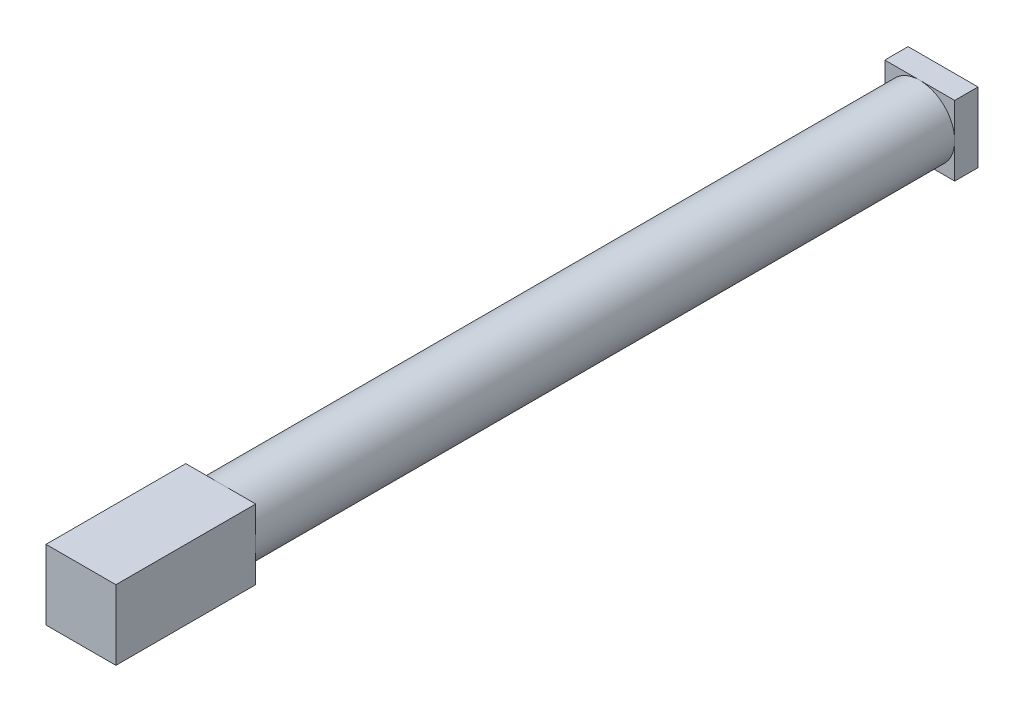
ISO-10303-21;
HEADER;
FILE_DESCRIPTION(('STEP AP214'),'2;1');
FILE_NAME('part.step','',(''),(''),'','','');
FILE_SCHEMA(('AUTOMOTIVE_DESIGN { 1 0 10303 214 1 1 1 1 }'));
ENDSEC;
DATA;
#1=APPLICATION_CONTEXT('core data for automotive mechanical design processes');
#2=APPLICATION_PROTOCOL_DEFINITION('international standard','automotive_design',2000,#1);
#3=PRODUCT_CONTEXT('',#1,'mechanical');
#4=PRODUCT('Part','Part','',(#3));
#5=PRODUCT_RELATED_PRODUCT_CATEGORY('part','',(#4));
#6=PRODUCT_DEFINITION_FORMATION('','',#4);
#7=PRODUCT_DEFINITION_CONTEXT('part definition',#1,'design');
#8=PRODUCT_DEFINITION('design','',#6,#7);
#9=PRODUCT_DEFINITION_SHAPE('','',#8);
#10=(LENGTH_UNIT() NAMED_UNIT(*) SI_UNIT(.MILLI.,.METRE.));
#11=(NAMED_UNIT(*) PLANE_ANGLE_UNIT() SI_UNIT($,.RADIAN.));
#12=(NAMED_UNIT(*) SI_UNIT($,.STERADIAN.) SOLID_ANGLE_UNIT());
#13=UNCERTAINTY_MEASURE_WITH_UNIT(LENGTH_MEASURE(1.E-05),#10,'distance_accuracy_value','');
#14=(GEOMETRIC_REPRESENTATION_CONTEXT(3) GLOBAL_UNCERTAINTY_ASSIGNED_CONTEXT((#13)) GLOBAL_UNIT_ASSIGNED_CONTEXT((#10,
#11,#12)) REPRESENTATION_CONTEXT('',''));
#15=CARTESIAN_POINT('',(0.,0.,0.));
#16=DIRECTION('',(0.,0.,1.));
#17=DIRECTION('',(1.,0.,0.));
#18=AXIS2_PLACEMENT_3D('',#15,#16,#17);
#19=CARTESIAN_POINT('',(0.,0.,19.0499999999999));
#20=DIRECTION('',(0.,0.,-0.999999999999998));
#21=DIRECTION('',(-1.,0.,0.));
#22=AXIS2_PLACEMENT_3D('',#19,#20,#21);
#23=CYLINDRICAL_SURFACE('',#22,1.905);
#24=CARTESIAN_POINT('',(0.,0.,19.0499999999999));
#25=DIRECTION('',(0.,0.,0.999999999999998));
#26=DIRECTION('',(1.,0.,0.));
#27=AXIS2_PLACEMENT_3D('',#24,#25,#26);
#28=CIRCLE('',#27,1.905);
#29=CARTESIAN_POINT('',(1.905,0.,19.0499999999999));
#30=VERTEX_POINT('',#29);
#31=CARTESIAN_POINT('',(0.,1.90500000000001,19.0499999999999));
#32=VERTEX_POINT('',#31);
#33=EDGE_CURVE('E13',#30,#32,#28,.T.);
#34=ORIENTED_EDGE('',*,*,#33,.F.);
#35=CARTESIAN_POINT('',(0.,-1.905,19.0499999999999));
#36=VERTEX_POINT('',#35);
#37=EDGE_CURVE('E57',#36,#30,#28,.T.);
#38=ORIENTED_EDGE('',*,*,#37,.F.);
#39=CARTESIAN_POINT('',(-1.905,0.,19.0499999999999));
#40=VERTEX_POINT('',#39);
#41=EDGE_CURVE('E216',#40,#36,#28,.T.);
#42=ORIENTED_EDGE('',*,*,#41,.F.);
#43=EDGE_CURVE('E56',#32,#40,#28,.T.);
#44=ORIENTED_EDGE('',*,*,#43,.F.);
#45=EDGE_LOOP('',(#34,#38,#42,#44));
#46=FACE_BOUND('',#45,.T.);
#47=CARTESIAN_POINT('',(0.,0.,-19.05));
#48=DIRECTION('',(0.,0.,0.999999999999998));
#49=DIRECTION('',(1.,0.,0.));
#50=AXIS2_PLACEMENT_3D('',#47,#48,#49);
#51=CIRCLE('',#50,1.905);
#52=CARTESIAN_POINT('',(1.905,0.,-19.05));
#53=VERTEX_POINT('',#52);
#54=CARTESIAN_POINT('',(0.,1.905,-19.05));
#55=VERTEX_POINT('',#54);
#56=EDGE_CURVE('E51',#53,#55,#51,.T.);
#57=ORIENTED_EDGE('',*,*,#56,.T.);
#58=CARTESIAN_POINT('',(-1.905,0.,-19.05));
#59=VERTEX_POINT('',#58);
#60=EDGE_CURVE('E213',#55,#59,#51,.T.);
#61=ORIENTED_EDGE('',*,*,#60,.T.);
#62=CARTESIAN_POINT('',(0.,-1.90500000000001,-19.05));
#63=VERTEX_POINT('',#62);
#64=EDGE_CURVE('E209',#59,#63,#51,.T.);
#65=ORIENTED_EDGE('',*,*,#64,.T.);
#66=EDGE_CURVE('E205',#63,#53,#51,.T.);
#67=ORIENTED_EDGE('',*,*,#66,.T.);
#68=EDGE_LOOP('',(#57,#61,#65,#67));
#69=FACE_BOUND('',#68,.T.);
#70=ADVANCED_FACE('F48',(#46,#69),#23,.T.);
#71=CARTESIAN_POINT('',(0.,0.,19.0499999999999));
#72=DIRECTION('',(0.,0.,-0.999999999999998));
#73=DIRECTION('',(-1.,0.,0.));
#74=AXIS2_PLACEMENT_3D('',#71,#72,#73);
#75=PLANE('',#74);
#76=DIRECTION('',(0.,1.,0.));
#77=VECTOR('',#76,1.);
#78=CARTESIAN_POINT('',(1.905,-1.905,19.0499999999999));
#79=LINE('',#78,#77);
#80=CARTESIAN_POINT('',(1.905,1.905,19.0499999999999));
#81=VERTEX_POINT('',#80);
#82=EDGE_CURVE('E164',#30,#81,#79,.T.);
#83=ORIENTED_EDGE('',*,*,#82,.F.);
#84=ORIENTED_EDGE('',*,*,#33,.T.);
#85=DIRECTION('',(-1.,0.,0.));
#86=VECTOR('',#85,1.);
#87=CARTESIAN_POINT('',(-1.905,1.90500000000002,19.0499999999999));
#88=LINE('',#87,#86);
#89=EDGE_CURVE('E185',#81,#32,#88,.T.);
#90=ORIENTED_EDGE('',*,*,#89,.F.);
#91=EDGE_LOOP('',(#83,#84,#90));
#92=FACE_BOUND('',#91,.T.);
#93=ADVANCED_FACE('F257',(#92),#75,.T.);
#94=CARTESIAN_POINT('',(-1.905,1.90500000000002,19.0499999999999));
#95=VERTEX_POINT('',#94);
#96=EDGE_CURVE('E184',#32,#95,#88,.T.);
#97=ORIENTED_EDGE('',*,*,#96,.F.);
#98=ORIENTED_EDGE('',*,*,#43,.T.);
#99=DIRECTION('',(0.,-1.,0.));
#100=VECTOR('',#99,1.);
#101=CARTESIAN_POINT('',(-1.905,-1.90499999999999,19.0499999999999));
#102=LINE('',#101,#100);
#103=EDGE_CURVE('E189',#95,#40,#102,.T.);
#104=ORIENTED_EDGE('',*,*,#103,.F.);
#105=EDGE_LOOP('',(#97,#98,#104));
#106=FACE_BOUND('',#105,.T.);
#107=ADVANCED_FACE('F261',(#106),#75,.T.);
#108=CARTESIAN_POINT('',(-1.905,-1.90499999999999,19.0499999999999));
#109=VERTEX_POINT('',#108);
#110=EDGE_CURVE('E188',#40,#109,#102,.T.);
#111=ORIENTED_EDGE('',*,*,#110,.F.);
#112=ORIENTED_EDGE('',*,*,#41,.T.);
#113=DIRECTION('',(1.,0.,0.));
#114=VECTOR('',#113,1.);
#115=CARTESIAN_POINT('',(-1.905,-1.90499999999999,19.0499999999999));
#116=LINE('',#115,#114);
#117=EDGE_CURVE('E176',#109,#36,#116,.T.);
#118=ORIENTED_EDGE('',*,*,#117,.F.);
#119=EDGE_LOOP('',(#111,#112,#118));
#120=FACE_BOUND('',#119,.T.);
#121=ADVANCED_FACE('F283',(#120),#75,.T.);
#122=CARTESIAN_POINT('',(1.905,-1.905,26.6699999999999));
#123=DIRECTION('',(-1.,0.,0.));
#124=DIRECTION('',(0.,0.,0.999999999999998));
#125=AXIS2_PLACEMENT_3D('',#122,#123,#124);
#126=PLANE('',#125);
#127=CARTESIAN_POINT('',(1.905,-1.905,19.0499999999999));
#128=VERTEX_POINT('',#127);
#129=EDGE_CURVE('E166',#128,#30,#79,.T.);
#130=ORIENTED_EDGE('',*,*,#129,.T.);
#131=ORIENTED_EDGE('',*,*,#82,.T.);
#132=DIRECTION('',(0.,0.,-0.999999999999998));
#133=VECTOR('',#132,1.);
#134=CARTESIAN_POINT('',(1.905,1.90500000000001,26.6699999999999));
#135=LINE('',#134,#133);
#136=CARTESIAN_POINT('',(1.905,1.90500000000001,26.6699999999999));
#137=VERTEX_POINT('',#136);
#138=EDGE_CURVE('E203',#137,#81,#135,.T.);
#139=ORIENTED_EDGE('',*,*,#138,.F.);
#140=DIRECTION('',(0.,1.,0.));
#141=VECTOR('',#140,1.);
#142=CARTESIAN_POINT('',(1.905,-1.905,26.6699999999999));
#143=LINE('',#142,#141);
#144=CARTESIAN_POINT('',(1.905,-1.905,26.6699999999999));
#145=VERTEX_POINT('',#144);
#146=EDGE_CURVE('E172',#145,#137,#143,.T.);
#147=ORIENTED_EDGE('',*,*,#146,.F.);
#148=DIRECTION('',(0.,0.,-0.999999999999998));
#149=VECTOR('',#148,1.);
#150=CARTESIAN_POINT('',(1.905,-1.905,26.6699999999999));
#151=LINE('',#150,#149);
#152=EDGE_CURVE('E181',#145,#128,#151,.T.);
#153=ORIENTED_EDGE('',*,*,#152,.T.);
#154=EDGE_LOOP('',(#130,#131,#139,#147,#153));
#155=FACE_BOUND('',#154,.T.);
#156=ADVANCED_FACE('F273',(#155),#126,.F.);
#157=CARTESIAN_POINT('',(-1.905,1.90500000000002,26.6699999999999));
#158=DIRECTION('',(0.,-1.,0.));
#159=DIRECTION('',(0.,0.,-0.999999999999998));
#160=AXIS2_PLACEMENT_3D('',#157,#158,#159);
#161=PLANE('',#160);
#162=ORIENTED_EDGE('',*,*,#89,.T.);
#163=ORIENTED_EDGE('',*,*,#96,.T.);
#164=DIRECTION('',(0.,0.,-0.999999999999998));
#165=VECTOR('',#164,1.);
#166=CARTESIAN_POINT('',(-1.905,1.90500000000002,26.6699999999999));
#167=LINE('',#166,#165);
#168=CARTESIAN_POINT('',(-1.905,1.90500000000002,26.6699999999999));
#169=VERTEX_POINT('',#168);
#170=EDGE_CURVE('E200',#169,#95,#167,.T.);
#171=ORIENTED_EDGE('',*,*,#170,.F.);
#172=DIRECTION('',(-1.,0.,0.));
#173=VECTOR('',#172,1.);
#174=CARTESIAN_POINT('',(-1.905,1.90500000000002,26.6699999999999));
#175=LINE('',#174,#173);
#176=EDGE_CURVE('E175',#137,#169,#175,.T.);
#177=ORIENTED_EDGE('',*,*,#176,.F.);
#178=ORIENTED_EDGE('',*,*,#138,.T.);
#179=EDGE_LOOP('',(#162,#163,#171,#177,#178));
#180=FACE_BOUND('',#179,.T.);
#181=ADVANCED_FACE('F287',(#180),#161,.F.);
#182=CARTESIAN_POINT('',(-1.905,-1.90499999999999,26.6699999999999));
#183=DIRECTION('',(1.,0.,0.));
#184=DIRECTION('',(0.,0.,-0.999999999999998));
#185=AXIS2_PLACEMENT_3D('',#182,#183,#184);
#186=PLANE('',#185);
#187=ORIENTED_EDGE('',*,*,#103,.T.);
#188=ORIENTED_EDGE('',*,*,#110,.T.);
#189=DIRECTION('',(0.,0.,-0.999999999999998));
#190=VECTOR('',#189,1.);
#191=CARTESIAN_POINT('',(-1.905,-1.90499999999999,26.6699999999999));
#192=LINE('',#191,#190);
#193=CARTESIAN_POINT('',(-1.905,-1.90499999999999,26.6699999999999));
#194=VERTEX_POINT('',#193);
#195=EDGE_CURVE('E197',#194,#109,#192,.T.);
#196=ORIENTED_EDGE('',*,*,#195,.F.);
#197=DIRECTION('',(0.,-1.,0.));
#198=VECTOR('',#197,1.);
#199=CARTESIAN_POINT('',(-1.905,-1.90499999999999,26.6699999999999));
#200=LINE('',#199,#198);
#201=EDGE_CURVE('E178',#169,#194,#200,.T.);
#202=ORIENTED_EDGE('',*,*,#201,.F.);
#203=ORIENTED_EDGE('',*,*,#170,.T.);
#204=EDGE_LOOP('',(#187,#188,#196,#202,#203));
#205=FACE_BOUND('',#204,.T.);
#206=ADVANCED_FACE('F289',(#205),#186,.F.);
#207=CARTESIAN_POINT('',(-1.905,-1.90499999999999,26.6699999999999));
#208=DIRECTION('',(0.,1.,0.));
#209=DIRECTION('',(0.,0.,0.999999999999998));
#210=AXIS2_PLACEMENT_3D('',#207,#208,#209);
#211=PLANE('',#210);
#212=ORIENTED_EDGE('',*,*,#117,.T.);
#213=EDGE_CURVE('E192',#36,#128,#116,.T.);
#214=ORIENTED_EDGE('',*,*,#213,.T.);
#215=ORIENTED_EDGE('',*,*,#152,.F.);
#216=DIRECTION('',(1.,0.,0.));
#217=VECTOR('',#216,1.);
#218=CARTESIAN_POINT('',(-1.905,-1.90499999999999,26.6699999999999));
#219=LINE('',#218,#217);
#220=EDGE_CURVE('E180',#194,#145,#219,.T.);
#221=ORIENTED_EDGE('',*,*,#220,.F.);
#222=ORIENTED_EDGE('',*,*,#195,.T.);
#223=EDGE_LOOP('',(#212,#214,#215,#221,#222));
#224=FACE_BOUND('',#223,.T.);
#225=ADVANCED_FACE('F278',(#224),#211,.F.);
#226=CARTESIAN_POINT('',(0.,0.,26.6699999999999));
#227=DIRECTION('',(0.,0.,-0.999999999999998));
#228=DIRECTION('',(-1.,0.,0.));
#229=AXIS2_PLACEMENT_3D('',#226,#227,#228);
#230=PLANE('',#229);
#231=ORIENTED_EDGE('',*,*,#146,.T.);
#232=ORIENTED_EDGE('',*,*,#176,.T.);
#233=ORIENTED_EDGE('',*,*,#201,.T.);
#234=ORIENTED_EDGE('',*,*,#220,.T.);
#235=EDGE_LOOP('',(#231,#232,#233,#234));
#236=FACE_BOUND('',#235,.T.);
#237=ADVANCED_FACE('F299',(#236),#230,.F.);
#238=ORIENTED_EDGE('',*,*,#213,.F.);
#239=ORIENTED_EDGE('',*,*,#37,.T.);
#240=ORIENTED_EDGE('',*,*,#129,.F.);
#241=EDGE_LOOP('',(#238,#239,#240));
#242=FACE_BOUND('',#241,.T.);
#243=ADVANCED_FACE('F264',(#242),#75,.T.);
#244=CARTESIAN_POINT('',(0.,0.,-19.05));
#245=DIRECTION('',(0.,0.,-0.999999999999998));
#246=DIRECTION('',(-1.,0.,0.));
#247=AXIS2_PLACEMENT_3D('',#244,#245,#246);
#248=PLANE('',#247);
#249=ORIENTED_EDGE('',*,*,#56,.F.);
#250=DIRECTION('',(0.,-1.,0.));
#251=VECTOR('',#250,1.);
#252=CARTESIAN_POINT('',(1.905,1.905,-19.05));
#253=LINE('',#252,#251);
#254=CARTESIAN_POINT('',(1.905,1.905,-19.05));
#255=VERTEX_POINT('',#254);
#256=EDGE_CURVE('E64',#255,#53,#253,.T.);
#257=ORIENTED_EDGE('',*,*,#256,.F.);
#258=DIRECTION('',(1.,0.,0.));
#259=VECTOR('',#258,1.);
#260=CARTESIAN_POINT('',(1.905,1.905,-19.05));
#261=LINE('',#260,#259);
#262=EDGE_CURVE('E222',#55,#255,#261,.T.);
#263=ORIENTED_EDGE('',*,*,#262,.F.);
#264=EDGE_LOOP('',(#249,#257,#263));
#265=FACE_BOUND('',#264,.T.);
#266=ADVANCED_FACE('F223',(#265),#248,.F.);
#267=ORIENTED_EDGE('',*,*,#60,.F.);
#268=CARTESIAN_POINT('',(-1.905,1.90500000000001,-19.05));
#269=VERTEX_POINT('',#268);
#270=EDGE_CURVE('E220',#269,#55,#261,.T.);
#271=ORIENTED_EDGE('',*,*,#270,.F.);
#272=DIRECTION('',(0.,1.,0.));
#273=VECTOR('',#272,1.);
#274=CARTESIAN_POINT('',(-1.905,1.90500000000001,-19.05));
#275=LINE('',#274,#273);
#276=EDGE_CURVE('E162',#59,#269,#275,.T.);
#277=ORIENTED_EDGE('',*,*,#276,.F.);
#278=EDGE_LOOP('',(#267,#271,#277));
#279=FACE_BOUND('',#278,.T.);
#280=ADVANCED_FACE('F219',(#279),#248,.F.);
#281=ORIENTED_EDGE('',*,*,#64,.F.);
#282=CARTESIAN_POINT('',(-1.905,-1.905,-19.05));
#283=VERTEX_POINT('',#282);
#284=EDGE_CURVE('E224',#283,#59,#275,.T.);
#285=ORIENTED_EDGE('',*,*,#284,.F.);
#286=DIRECTION('',(-1.,0.,0.));
#287=VECTOR('',#286,1.);
#288=CARTESIAN_POINT('',(1.905,-1.905,-19.05));
#289=LINE('',#288,#287);
#290=EDGE_CURVE('E231',#63,#283,#289,.T.);
#291=ORIENTED_EDGE('',*,*,#290,.F.);
#292=EDGE_LOOP('',(#281,#285,#291));
#293=FACE_BOUND('',#292,.T.);
#294=ADVANCED_FACE('F245',(#293),#248,.F.);
#295=CARTESIAN_POINT('',(-1.905,1.90500000000001,-20.32));
#296=DIRECTION('',(1.,0.,0.));
#297=DIRECTION('',(0.,1.,0.));
#298=AXIS2_PLACEMENT_3D('',#295,#296,#297);
#299=PLANE('',#298);
#300=ORIENTED_EDGE('',*,*,#284,.T.);
#301=ORIENTED_EDGE('',*,*,#276,.T.);
#302=DIRECTION('',(0.,0.,0.999999999999998));
#303=VECTOR('',#302,1.);
#304=CARTESIAN_POINT('',(-1.905,1.90500000000001,-20.32));
#305=LINE('',#304,#303);
#306=CARTESIAN_POINT('',(-1.905,1.90500000000001,-20.32));
#307=VERTEX_POINT('',#306);
#308=EDGE_CURVE('E143',#307,#269,#305,.T.);
#309=ORIENTED_EDGE('',*,*,#308,.F.);
#310=DIRECTION('',(0.,1.,0.));
#311=VECTOR('',#310,1.);
#312=CARTESIAN_POINT('',(-1.905,1.90500000000001,-20.32));
#313=LINE('',#312,#311);
#314=CARTESIAN_POINT('',(-1.905,-1.905,-20.32));
#315=VERTEX_POINT('',#314);
#316=EDGE_CURVE('E148',#315,#307,#313,.T.);
#317=ORIENTED_EDGE('',*,*,#316,.F.);
#318=DIRECTION('',(0.,0.,0.999999999999998));
#319=VECTOR('',#318,1.);
#320=CARTESIAN_POINT('',(-1.905,-1.905,-20.32));
#321=LINE('',#320,#319);
#322=EDGE_CURVE('E234',#315,#283,#321,.T.);
#323=ORIENTED_EDGE('',*,*,#322,.T.);
#324=EDGE_LOOP('',(#300,#301,#309,#317,#323));
#325=FACE_BOUND('',#324,.T.);
#326=ADVANCED_FACE('F160',(#325),#299,.F.);
#327=CARTESIAN_POINT('',(1.905,1.905,-20.32));
#328=DIRECTION('',(0.,-1.,0.));
#329=DIRECTION('',(0.,0.,-0.999999999999998));
#330=AXIS2_PLACEMENT_3D('',#327,#328,#329);
#331=PLANE('',#330);
#332=ORIENTED_EDGE('',*,*,#270,.T.);
#333=ORIENTED_EDGE('',*,*,#262,.T.);
#334=DIRECTION('',(0.,0.,0.999999999999998));
#335=VECTOR('',#334,1.);
#336=CARTESIAN_POINT('',(1.905,1.905,-20.32));
#337=LINE('',#336,#335);
#338=CARTESIAN_POINT('',(1.905,1.905,-20.32));
#339=VERTEX_POINT('',#338);
#340=EDGE_CURVE('E144',#339,#255,#337,.T.);
#341=ORIENTED_EDGE('',*,*,#340,.F.);
#342=DIRECTION('',(1.,0.,0.));
#343=VECTOR('',#342,1.);
#344=CARTESIAN_POINT('',(1.905,1.905,-20.32));
#345=LINE('',#344,#343);
#346=EDGE_CURVE('E138',#307,#339,#345,.T.);
#347=ORIENTED_EDGE('',*,*,#346,.F.);
#348=ORIENTED_EDGE('',*,*,#308,.T.);
#349=EDGE_LOOP('',(#332,#333,#341,#347,#348));
#350=FACE_BOUND('',#349,.T.);
#351=ADVANCED_FACE('F141',(#350),#331,.F.);
#352=CARTESIAN_POINT('',(1.905,1.905,-20.32));
#353=DIRECTION('',(-1.,0.,0.));
#354=DIRECTION('',(0.,-1.,0.));
#355=AXIS2_PLACEMENT_3D('',#352,#353,#354);
#356=PLANE('',#355);
#357=ORIENTED_EDGE('',*,*,#256,.T.);
#358=CARTESIAN_POINT('',(1.905,-1.905,-19.05));
#359=VERTEX_POINT('',#358);
#360=EDGE_CURVE('E226',#53,#359,#253,.T.);
#361=ORIENTED_EDGE('',*,*,#360,.T.);
#362=DIRECTION('',(0.,0.,0.999999999999998));
#363=VECTOR('',#362,1.);
#364=CARTESIAN_POINT('',(1.905,-1.905,-20.32));
#365=LINE('',#364,#363);
#366=CARTESIAN_POINT('',(1.905,-1.905,-20.32));
#367=VERTEX_POINT('',#366);
#368=EDGE_CURVE('E168',#367,#359,#365,.T.);
#369=ORIENTED_EDGE('',*,*,#368,.F.);
#370=DIRECTION('',(0.,-1.,0.));
#371=VECTOR('',#370,1.);
#372=CARTESIAN_POINT('',(1.905,1.905,-20.32));
#373=LINE('',#372,#371);
#374=EDGE_CURVE('E147',#339,#367,#373,.T.);
#375=ORIENTED_EDGE('',*,*,#374,.F.);
#376=ORIENTED_EDGE('',*,*,#340,.T.);
#377=EDGE_LOOP('',(#357,#361,#369,#375,#376));
#378=FACE_BOUND('',#377,.T.);
#379=ADVANCED_FACE('F307',(#378),#356,.F.);
#380=CARTESIAN_POINT('',(1.905,-1.905,-20.32));
#381=DIRECTION('',(0.,1.,0.));
#382=DIRECTION('',(0.,0.,0.999999999999998));
#383=AXIS2_PLACEMENT_3D('',#380,#381,#382);
#384=PLANE('',#383);
#385=EDGE_CURVE('E157',#359,#63,#289,.T.);
#386=ORIENTED_EDGE('',*,*,#385,.T.);
#387=ORIENTED_EDGE('',*,*,#290,.T.);
#388=ORIENTED_EDGE('',*,*,#322,.F.);
#389=DIRECTION('',(-1.,0.,0.));
#390=VECTOR('',#389,1.);
#391=CARTESIAN_POINT('',(1.905,-1.905,-20.32));
#392=LINE('',#391,#390);
#393=EDGE_CURVE('E153',#367,#315,#392,.T.);
#394=ORIENTED_EDGE('',*,*,#393,.F.);
#395=ORIENTED_EDGE('',*,*,#368,.T.);
#396=EDGE_LOOP('',(#386,#387,#388,#394,#395));
#397=FACE_BOUND('',#396,.T.);
#398=ADVANCED_FACE('F239',(#397),#384,.F.);
#399=CARTESIAN_POINT('',(0.,0.,-20.32));
#400=DIRECTION('',(0.,0.,-0.999999999999998));
#401=DIRECTION('',(-1.,0.,0.));
#402=AXIS2_PLACEMENT_3D('',#399,#400,#401);
#403=PLANE('',#402);
#404=ORIENTED_EDGE('',*,*,#316,.T.);
#405=ORIENTED_EDGE('',*,*,#346,.T.);
#406=ORIENTED_EDGE('',*,*,#374,.T.);
#407=ORIENTED_EDGE('',*,*,#393,.T.);
#408=EDGE_LOOP('',(#404,#405,#406,#407));
#409=FACE_BOUND('',#408,.T.);
#410=ADVANCED_FACE('F151',(#409),#403,.T.);
#411=ORIENTED_EDGE('',*,*,#66,.F.);
#412=ORIENTED_EDGE('',*,*,#385,.F.);
#413=ORIENTED_EDGE('',*,*,#360,.F.);
#414=EDGE_LOOP('',(#411,#412,#413));
#415=FACE_BOUND('',#414,.T.);
#416=ADVANCED_FACE('F241',(#415),#248,.F.);
#417=CLOSED_SHELL('',(#70,#93,#107,#121,#156,#181,#206,#225,#237,#243,#266,#280,#294,#326,#351,
#379,#398,#410,#416));
#418=MANIFOLD_SOLID_BREP('B2',#417);
#419=ADVANCED_BREP_SHAPE_REPRESENTATION('',(#18,#418),#14);
#420=SHAPE_DEFINITION_REPRESENTATION(#9,#419);
ENDSEC;
END-ISO-10303-21;
